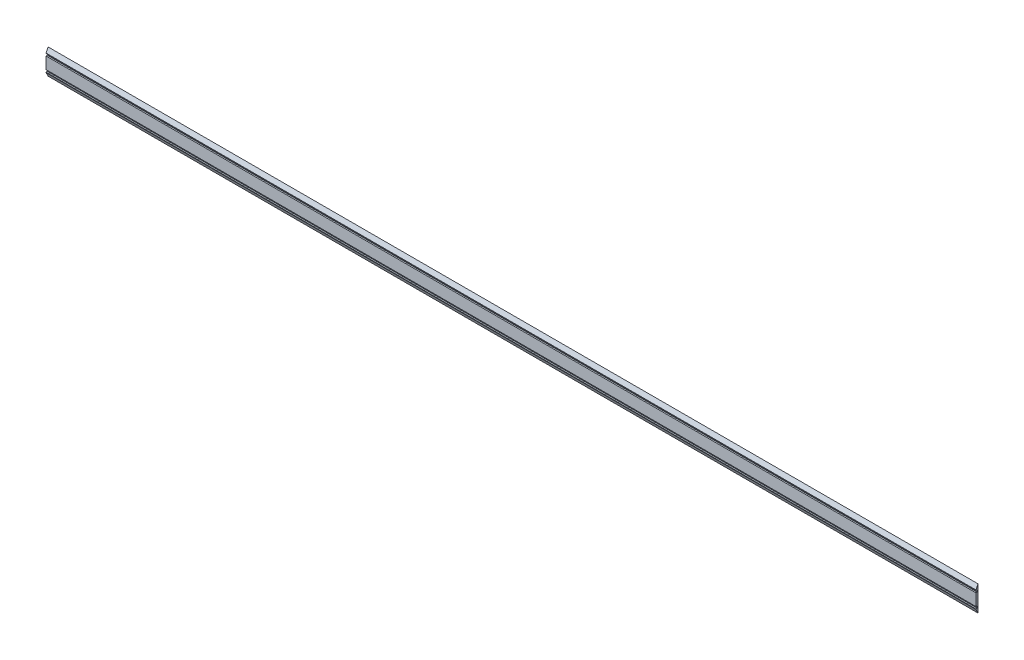
ISO-10303-21;
HEADER;
FILE_DESCRIPTION(('STEP AP214'),'2;1');
FILE_NAME('part.step','',(''),(''),'','','');
FILE_SCHEMA(('AUTOMOTIVE_DESIGN { 1 0 10303 214 1 1 1 1 }'));
ENDSEC;
DATA;
#1=APPLICATION_CONTEXT('core data for automotive mechanical design processes');
#2=APPLICATION_PROTOCOL_DEFINITION('international standard','automotive_design',2000,#1);
#3=PRODUCT_CONTEXT('',#1,'mechanical');
#4=PRODUCT('Part','Part','',(#3));
#5=PRODUCT_RELATED_PRODUCT_CATEGORY('part','',(#4));
#6=PRODUCT_DEFINITION_FORMATION('','',#4);
#7=PRODUCT_DEFINITION_CONTEXT('part definition',#1,'design');
#8=PRODUCT_DEFINITION('design','',#6,#7);
#9=PRODUCT_DEFINITION_SHAPE('','',#8);
#10=(LENGTH_UNIT() NAMED_UNIT(*) SI_UNIT(.MILLI.,.METRE.));
#11=(NAMED_UNIT(*) PLANE_ANGLE_UNIT() SI_UNIT($,.RADIAN.));
#12=(NAMED_UNIT(*) SI_UNIT($,.STERADIAN.) SOLID_ANGLE_UNIT());
#13=UNCERTAINTY_MEASURE_WITH_UNIT(LENGTH_MEASURE(1.E-05),#10,'distance_accuracy_value','');
#14=(GEOMETRIC_REPRESENTATION_CONTEXT(3) GLOBAL_UNCERTAINTY_ASSIGNED_CONTEXT((#13)) GLOBAL_UNIT_ASSIGNED_CONTEXT((#10,
#11,#12)) REPRESENTATION_CONTEXT('',''));
#15=CARTESIAN_POINT('',(0.,0.,0.));
#16=DIRECTION('',(0.,0.,1.));
#17=DIRECTION('',(1.,0.,0.));
#18=AXIS2_PLACEMENT_3D('',#15,#16,#17);
#19=CARTESIAN_POINT('',(0.,0.,5.));
#20=DIRECTION('',(0.,0.,-1.));
#21=DIRECTION('',(-1.,0.,0.));
#22=AXIS2_PLACEMENT_3D('',#19,#20,#21);
#23=PLANE('',#22);
#24=DIRECTION('',(0.,-1.,0.));
#25=VECTOR('',#24,1.);
#26=CARTESIAN_POINT('',(0.,-60.,5.));
#27=LINE('',#26,#25);
#28=CARTESIAN_POINT('',(0.,-16.0000000000002,5.));
#29=VERTEX_POINT('',#28);
#30=CARTESIAN_POINT('',(0.,-43.9999999999995,5.));
#31=VERTEX_POINT('',#30);
#32=EDGE_CURVE('E184',#29,#31,#27,.T.);
#33=ORIENTED_EDGE('',*,*,#32,.T.);
#34=DIRECTION('',(-1.,0.,0.));
#35=VECTOR('',#34,1.);
#36=CARTESIAN_POINT('',(0.,-43.9999999999995,5.));
#37=LINE('',#36,#35);
#38=CARTESIAN_POINT('',(2200.,-43.9999999999995,5.));
#39=VERTEX_POINT('',#38);
#40=EDGE_CURVE('E143',#39,#31,#37,.T.);
#41=ORIENTED_EDGE('',*,*,#40,.F.);
#42=DIRECTION('',(0.,1.,0.));
#43=VECTOR('',#42,1.);
#44=CARTESIAN_POINT('',(2200.,-60.,5.));
#45=LINE('',#44,#43);
#46=CARTESIAN_POINT('',(2200.,-16.,5.));
#47=VERTEX_POINT('',#46);
#48=EDGE_CURVE('E189',#39,#47,#45,.T.);
#49=ORIENTED_EDGE('',*,*,#48,.T.);
#50=DIRECTION('',(1.,0.,0.));
#51=VECTOR('',#50,1.);
#52=CARTESIAN_POINT('',(2200.,-16.,5.));
#53=LINE('',#52,#51);
#54=EDGE_CURVE('E159',#29,#47,#53,.T.);
#55=ORIENTED_EDGE('',*,*,#54,.F.);
#56=EDGE_LOOP('',(#33,#41,#49,#55));
#57=FACE_BOUND('',#56,.T.);
#58=ADVANCED_FACE('F38',(#57),#23,.F.);
#59=CARTESIAN_POINT('',(2200.,-49.9999999999995,5.));
#60=VERTEX_POINT('',#59);
#61=CARTESIAN_POINT('',(2200.,-48.9999999999995,5.));
#62=VERTEX_POINT('',#61);
#63=EDGE_CURVE('E185',#60,#62,#45,.T.);
#64=ORIENTED_EDGE('',*,*,#63,.T.);
#65=DIRECTION('',(1.,0.,0.));
#66=VECTOR('',#65,1.);
#67=CARTESIAN_POINT('',(0.,-48.9999999999995,5.));
#68=LINE('',#67,#66);
#69=CARTESIAN_POINT('',(0.,-48.9999999999995,5.));
#70=VERTEX_POINT('',#69);
#71=EDGE_CURVE('E173',#70,#62,#68,.T.);
#72=ORIENTED_EDGE('',*,*,#71,.F.);
#73=CARTESIAN_POINT('',(0.,-49.9999999999995,5.));
#74=VERTEX_POINT('',#73);
#75=EDGE_CURVE('E148',#70,#74,#27,.T.);
#76=ORIENTED_EDGE('',*,*,#75,.T.);
#77=DIRECTION('',(1.,0.,0.));
#78=VECTOR('',#77,1.);
#79=CARTESIAN_POINT('',(0.,-49.9999999999995,5.));
#80=LINE('',#79,#78);
#81=EDGE_CURVE('E188',#74,#60,#80,.T.);
#82=ORIENTED_EDGE('',*,*,#81,.T.);
#83=EDGE_LOOP('',(#64,#72,#76,#82));
#84=FACE_BOUND('',#83,.T.);
#85=ADVANCED_FACE('F245',(#84),#23,.F.);
#86=CARTESIAN_POINT('',(0.,-60.,5.));
#87=DIRECTION('',(1.,0.,0.));
#88=DIRECTION('',(0.,0.,-1.));
#89=AXIS2_PLACEMENT_3D('',#86,#87,#88);
#90=PLANE('',#89);
#91=DIRECTION('',(0.,-1.,0.));
#92=VECTOR('',#91,1.);
#93=CARTESIAN_POINT('',(0.,-48.9999999999995,2.));
#94=LINE('',#93,#92);
#95=CARTESIAN_POINT('',(0.,-43.9999999999995,2.));
#96=VERTEX_POINT('',#95);
#97=CARTESIAN_POINT('',(0.,-48.9999999999995,2.));
#98=VERTEX_POINT('',#97);
#99=EDGE_CURVE('E134',#96,#98,#94,.T.);
#100=ORIENTED_EDGE('',*,*,#99,.F.);
#101=DIRECTION('',(0.,0.,1.));
#102=VECTOR('',#101,1.);
#103=CARTESIAN_POINT('',(0.,-43.9999999999995,2.));
#104=LINE('',#103,#102);
#105=EDGE_CURVE('E194',#96,#31,#104,.T.);
#106=ORIENTED_EDGE('',*,*,#105,.T.);
#107=ORIENTED_EDGE('',*,*,#32,.F.);
#108=DIRECTION('',(0.,0.,1.));
#109=VECTOR('',#108,1.);
#110=CARTESIAN_POINT('',(0.,-16.0000000000002,2.));
#111=LINE('',#110,#109);
#112=CARTESIAN_POINT('',(0.,-16.0000000000002,2.));
#113=VERTEX_POINT('',#112);
#114=EDGE_CURVE('E174',#113,#29,#111,.T.);
#115=ORIENTED_EDGE('',*,*,#114,.F.);
#116=DIRECTION('',(0.,-1.,0.));
#117=VECTOR('',#116,1.);
#118=CARTESIAN_POINT('',(0.,-11.0000000000002,2.));
#119=LINE('',#118,#117);
#120=CARTESIAN_POINT('',(0.,-11.0000000000002,2.));
#121=VERTEX_POINT('',#120);
#122=EDGE_CURVE('E162',#121,#113,#119,.T.);
#123=ORIENTED_EDGE('',*,*,#122,.F.);
#124=DIRECTION('',(0.,0.,1.));
#125=VECTOR('',#124,1.);
#126=CARTESIAN_POINT('',(0.,-11.0000000000002,2.));
#127=LINE('',#126,#125);
#128=CARTESIAN_POINT('',(0.,-11.0000000000002,5.));
#129=VERTEX_POINT('',#128);
#130=EDGE_CURVE('E176',#121,#129,#127,.T.);
#131=ORIENTED_EDGE('',*,*,#130,.T.);
#132=CARTESIAN_POINT('',(0.,-10.0000000000002,5.));
#133=VERTEX_POINT('',#132);
#134=EDGE_CURVE('E180',#133,#129,#27,.T.);
#135=ORIENTED_EDGE('',*,*,#134,.F.);
#136=DIRECTION('',(0.,-0.89442719099992,0.44721359549995));
#137=VECTOR('',#136,1.);
#138=CARTESIAN_POINT('',(0.,-10.0000000000002,5.));
#139=LINE('',#138,#137);
#140=CARTESIAN_POINT('',(0.,0.,0.));
#141=VERTEX_POINT('',#140);
#142=EDGE_CURVE('E209',#133,#141,#139,.F.);
#143=ORIENTED_EDGE('',*,*,#142,.T.);
#144=DIRECTION('',(0.,-1.,0.));
#145=VECTOR('',#144,1.);
#146=CARTESIAN_POINT('',(0.,-60.,0.));
#147=LINE('',#146,#145);
#148=CARTESIAN_POINT('',(0.,-60.,0.));
#149=VERTEX_POINT('',#148);
#150=EDGE_CURVE('E190',#141,#149,#147,.T.);
#151=ORIENTED_EDGE('',*,*,#150,.T.);
#152=DIRECTION('',(0.,-0.894427190999916,-0.447213595499958));
#153=VECTOR('',#152,1.);
#154=CARTESIAN_POINT('',(0.,-49.9999999999995,5.));
#155=LINE('',#154,#153);
#156=EDGE_CURVE('E207',#149,#74,#155,.F.);
#157=ORIENTED_EDGE('',*,*,#156,.T.);
#158=ORIENTED_EDGE('',*,*,#75,.F.);
#159=DIRECTION('',(0.,0.,1.));
#160=VECTOR('',#159,1.);
#161=CARTESIAN_POINT('',(0.,-48.9999999999995,2.));
#162=LINE('',#161,#160);
#163=EDGE_CURVE('E54',#98,#70,#162,.T.);
#164=ORIENTED_EDGE('',*,*,#163,.F.);
#165=EDGE_LOOP('',(#100,#106,#107,#115,#123,#131,#135,#143,#151,#157,#158,#164));
#166=FACE_BOUND('',#165,.T.);
#167=ADVANCED_FACE('F146',(#166),#90,.F.);
#168=CARTESIAN_POINT('',(2200.,-60.,5.));
#169=DIRECTION('',(-1.,0.,0.));
#170=DIRECTION('',(0.,0.,1.));
#171=AXIS2_PLACEMENT_3D('',#168,#169,#170);
#172=PLANE('',#171);
#173=ORIENTED_EDGE('',*,*,#48,.F.);
#174=DIRECTION('',(0.,0.,1.));
#175=VECTOR('',#174,1.);
#176=CARTESIAN_POINT('',(2200.,-43.9999999999995,2.));
#177=LINE('',#176,#175);
#178=CARTESIAN_POINT('',(2200.,-43.9999999999995,2.));
#179=VERTEX_POINT('',#178);
#180=EDGE_CURVE('E150',#179,#39,#177,.T.);
#181=ORIENTED_EDGE('',*,*,#180,.F.);
#182=DIRECTION('',(0.,1.,0.));
#183=VECTOR('',#182,1.);
#184=CARTESIAN_POINT('',(2200.,-48.9999999999995,2.));
#185=LINE('',#184,#183);
#186=CARTESIAN_POINT('',(2200.,-48.9999999999995,2.));
#187=VERTEX_POINT('',#186);
#188=EDGE_CURVE('E133',#187,#179,#185,.T.);
#189=ORIENTED_EDGE('',*,*,#188,.F.);
#190=DIRECTION('',(0.,0.,1.));
#191=VECTOR('',#190,1.);
#192=CARTESIAN_POINT('',(2200.,-48.9999999999995,2.));
#193=LINE('',#192,#191);
#194=EDGE_CURVE('E130',#187,#62,#193,.T.);
#195=ORIENTED_EDGE('',*,*,#194,.T.);
#196=ORIENTED_EDGE('',*,*,#63,.F.);
#197=DIRECTION('',(0.,0.894427190999916,0.447213595499958));
#198=VECTOR('',#197,1.);
#199=CARTESIAN_POINT('',(2200.,-49.9999999999995,5.));
#200=LINE('',#199,#198);
#201=CARTESIAN_POINT('',(2200.,-60.,0.));
#202=VERTEX_POINT('',#201);
#203=EDGE_CURVE('E47',#60,#202,#200,.F.);
#204=ORIENTED_EDGE('',*,*,#203,.T.);
#205=DIRECTION('',(0.,1.,0.));
#206=VECTOR('',#205,1.);
#207=CARTESIAN_POINT('',(2200.,-60.,0.));
#208=LINE('',#207,#206);
#209=CARTESIAN_POINT('',(2200.,0.,0.));
#210=VERTEX_POINT('',#209);
#211=EDGE_CURVE('E197',#202,#210,#208,.T.);
#212=ORIENTED_EDGE('',*,*,#211,.T.);
#213=DIRECTION('',(0.,0.89442719099992,-0.44721359549995));
#214=VECTOR('',#213,1.);
#215=CARTESIAN_POINT('',(2200.,-10.0000000000002,5.));
#216=LINE('',#215,#214);
#217=CARTESIAN_POINT('',(2200.,-10.0000000000002,5.));
#218=VERTEX_POINT('',#217);
#219=EDGE_CURVE('E11',#210,#218,#216,.F.);
#220=ORIENTED_EDGE('',*,*,#219,.T.);
#221=CARTESIAN_POINT('',(2200.,-11.0000000000001,5.));
#222=VERTEX_POINT('',#221);
#223=EDGE_CURVE('E183',#222,#218,#45,.T.);
#224=ORIENTED_EDGE('',*,*,#223,.F.);
#225=DIRECTION('',(0.,0.,1.));
#226=VECTOR('',#225,1.);
#227=CARTESIAN_POINT('',(2200.,-11.,2.));
#228=LINE('',#227,#226);
#229=CARTESIAN_POINT('',(2200.,-11.,2.));
#230=VERTEX_POINT('',#229);
#231=EDGE_CURVE('E62',#230,#222,#228,.T.);
#232=ORIENTED_EDGE('',*,*,#231,.F.);
#233=DIRECTION('',(0.,1.,0.));
#234=VECTOR('',#233,1.);
#235=CARTESIAN_POINT('',(2200.,-11.,2.));
#236=LINE('',#235,#234);
#237=CARTESIAN_POINT('',(2200.,-16.,2.));
#238=VERTEX_POINT('',#237);
#239=EDGE_CURVE('E155',#238,#230,#236,.T.);
#240=ORIENTED_EDGE('',*,*,#239,.F.);
#241=DIRECTION('',(0.,0.,1.));
#242=VECTOR('',#241,1.);
#243=CARTESIAN_POINT('',(2200.,-16.,2.));
#244=LINE('',#243,#242);
#245=EDGE_CURVE('E170',#238,#47,#244,.T.);
#246=ORIENTED_EDGE('',*,*,#245,.T.);
#247=EDGE_LOOP('',(#173,#181,#189,#195,#196,#204,#212,#220,#224,#232,#240,#246));
#248=FACE_BOUND('',#247,.T.);
#249=ADVANCED_FACE('F214',(#248),#172,.F.);
#250=ORIENTED_EDGE('',*,*,#134,.T.);
#251=DIRECTION('',(-1.,0.,0.));
#252=VECTOR('',#251,1.);
#253=CARTESIAN_POINT('',(2200.,-11.,5.));
#254=LINE('',#253,#252);
#255=EDGE_CURVE('E167',#222,#129,#254,.T.);
#256=ORIENTED_EDGE('',*,*,#255,.F.);
#257=ORIENTED_EDGE('',*,*,#223,.T.);
#258=DIRECTION('',(-1.,0.,0.));
#259=VECTOR('',#258,1.);
#260=CARTESIAN_POINT('',(0.,-10.0000000000002,5.));
#261=LINE('',#260,#259);
#262=EDGE_CURVE('E204',#218,#133,#261,.T.);
#263=ORIENTED_EDGE('',*,*,#262,.T.);
#264=EDGE_LOOP('',(#250,#256,#257,#263));
#265=FACE_BOUND('',#264,.T.);
#266=ADVANCED_FACE('F264',(#265),#23,.F.);
#267=CARTESIAN_POINT('',(0.,0.,0.));
#268=DIRECTION('',(0.,0.,-1.));
#269=DIRECTION('',(-1.,0.,0.));
#270=AXIS2_PLACEMENT_3D('',#267,#268,#269);
#271=PLANE('',#270);
#272=ORIENTED_EDGE('',*,*,#150,.F.);
#273=DIRECTION('',(-1.,0.,0.));
#274=VECTOR('',#273,1.);
#275=CARTESIAN_POINT('',(0.,0.,0.));
#276=LINE('',#275,#274);
#277=EDGE_CURVE('E199',#210,#141,#276,.T.);
#278=ORIENTED_EDGE('',*,*,#277,.F.);
#279=ORIENTED_EDGE('',*,*,#211,.F.);
#280=DIRECTION('',(1.,0.,0.));
#281=VECTOR('',#280,1.);
#282=CARTESIAN_POINT('',(0.,-60.,0.));
#283=LINE('',#282,#281);
#284=EDGE_CURVE('E193',#149,#202,#283,.T.);
#285=ORIENTED_EDGE('',*,*,#284,.F.);
#286=EDGE_LOOP('',(#272,#278,#279,#285));
#287=FACE_BOUND('',#286,.T.);
#288=ADVANCED_FACE('F220',(#287),#271,.T.);
#289=CARTESIAN_POINT('',(0.,-10.0000000000002,5.));
#290=DIRECTION('',(0.,-0.44721359549995,-0.89442719099992));
#291=DIRECTION('',(-1.,0.,0.));
#292=AXIS2_PLACEMENT_3D('',#289,#290,#291);
#293=PLANE('',#292);
#294=ORIENTED_EDGE('',*,*,#219,.F.);
#295=ORIENTED_EDGE('',*,*,#277,.T.);
#296=ORIENTED_EDGE('',*,*,#142,.F.);
#297=ORIENTED_EDGE('',*,*,#262,.F.);
#298=EDGE_LOOP('',(#294,#295,#296,#297));
#299=FACE_BOUND('',#298,.T.);
#300=ADVANCED_FACE('F225',(#299),#293,.F.);
#301=CARTESIAN_POINT('',(0.,-49.9999999999995,5.));
#302=DIRECTION('',(0.,0.447213595499958,-0.894427190999916));
#303=DIRECTION('',(1.,0.,0.));
#304=AXIS2_PLACEMENT_3D('',#301,#302,#303);
#305=PLANE('',#304);
#306=ORIENTED_EDGE('',*,*,#156,.F.);
#307=ORIENTED_EDGE('',*,*,#284,.T.);
#308=ORIENTED_EDGE('',*,*,#203,.F.);
#309=ORIENTED_EDGE('',*,*,#81,.F.);
#310=EDGE_LOOP('',(#306,#307,#308,#309));
#311=FACE_BOUND('',#310,.T.);
#312=ADVANCED_FACE('F41',(#311),#305,.F.);
#313=CARTESIAN_POINT('',(2200.,-16.,2.));
#314=DIRECTION('',(0.,-1.,0.));
#315=DIRECTION('',(1.,0.,0.));
#316=AXIS2_PLACEMENT_3D('',#313,#314,#315);
#317=PLANE('',#316);
#318=ORIENTED_EDGE('',*,*,#54,.T.);
#319=ORIENTED_EDGE('',*,*,#245,.F.);
#320=DIRECTION('',(1.,0.,0.));
#321=VECTOR('',#320,1.);
#322=CARTESIAN_POINT('',(2200.,-16.,2.));
#323=LINE('',#322,#321);
#324=EDGE_CURVE('E164',#113,#238,#323,.T.);
#325=ORIENTED_EDGE('',*,*,#324,.F.);
#326=ORIENTED_EDGE('',*,*,#114,.T.);
#327=EDGE_LOOP('',(#318,#319,#325,#326));
#328=FACE_BOUND('',#327,.T.);
#329=ADVANCED_FACE('F239',(#328),#317,.F.);
#330=CARTESIAN_POINT('',(2200.,-11.,2.));
#331=DIRECTION('',(0.,1.,0.));
#332=DIRECTION('',(-1.,0.,0.));
#333=AXIS2_PLACEMENT_3D('',#330,#331,#332);
#334=PLANE('',#333);
#335=ORIENTED_EDGE('',*,*,#255,.T.);
#336=ORIENTED_EDGE('',*,*,#130,.F.);
#337=DIRECTION('',(-1.,0.,0.));
#338=VECTOR('',#337,1.);
#339=CARTESIAN_POINT('',(2200.,-11.,2.));
#340=LINE('',#339,#338);
#341=EDGE_CURVE('E158',#230,#121,#340,.T.);
#342=ORIENTED_EDGE('',*,*,#341,.F.);
#343=ORIENTED_EDGE('',*,*,#231,.T.);
#344=EDGE_LOOP('',(#335,#336,#342,#343));
#345=FACE_BOUND('',#344,.T.);
#346=ADVANCED_FACE('F259',(#345),#334,.F.);
#347=CARTESIAN_POINT('',(0.,0.,2.));
#348=DIRECTION('',(0.,0.,-1.));
#349=DIRECTION('',(-1.,0.,0.));
#350=AXIS2_PLACEMENT_3D('',#347,#348,#349);
#351=PLANE('',#350);
#352=ORIENTED_EDGE('',*,*,#239,.T.);
#353=ORIENTED_EDGE('',*,*,#341,.T.);
#354=ORIENTED_EDGE('',*,*,#122,.T.);
#355=ORIENTED_EDGE('',*,*,#324,.T.);
#356=EDGE_LOOP('',(#352,#353,#354,#355));
#357=FACE_BOUND('',#356,.T.);
#358=ADVANCED_FACE('F242',(#357),#351,.F.);
#359=CARTESIAN_POINT('',(0.,-43.9999999999995,2.));
#360=DIRECTION('',(0.,1.,0.));
#361=DIRECTION('',(0.,0.,1.));
#362=AXIS2_PLACEMENT_3D('',#359,#360,#361);
#363=PLANE('',#362);
#364=ORIENTED_EDGE('',*,*,#40,.T.);
#365=ORIENTED_EDGE('',*,*,#105,.F.);
#366=DIRECTION('',(-1.,0.,0.));
#367=VECTOR('',#366,1.);
#368=CARTESIAN_POINT('',(0.,-43.9999999999995,2.));
#369=LINE('',#368,#367);
#370=EDGE_CURVE('E140',#179,#96,#369,.T.);
#371=ORIENTED_EDGE('',*,*,#370,.F.);
#372=ORIENTED_EDGE('',*,*,#180,.T.);
#373=EDGE_LOOP('',(#364,#365,#371,#372));
#374=FACE_BOUND('',#373,.T.);
#375=ADVANCED_FACE('F251',(#374),#363,.F.);
#376=CARTESIAN_POINT('',(0.,-48.9999999999995,2.));
#377=DIRECTION('',(0.,-1.,0.));
#378=DIRECTION('',(0.,0.,-1.));
#379=AXIS2_PLACEMENT_3D('',#376,#377,#378);
#380=PLANE('',#379);
#381=ORIENTED_EDGE('',*,*,#71,.T.);
#382=ORIENTED_EDGE('',*,*,#194,.F.);
#383=DIRECTION('',(1.,0.,0.));
#384=VECTOR('',#383,1.);
#385=CARTESIAN_POINT('',(0.,-48.9999999999995,2.));
#386=LINE('',#385,#384);
#387=EDGE_CURVE('E126',#98,#187,#386,.T.);
#388=ORIENTED_EDGE('',*,*,#387,.F.);
#389=ORIENTED_EDGE('',*,*,#163,.T.);
#390=EDGE_LOOP('',(#381,#382,#388,#389));
#391=FACE_BOUND('',#390,.T.);
#392=ADVANCED_FACE('F128',(#391),#380,.F.);
#393=CARTESIAN_POINT('',(0.,0.,2.));
#394=DIRECTION('',(0.,0.,-1.));
#395=DIRECTION('',(-1.,0.,0.));
#396=AXIS2_PLACEMENT_3D('',#393,#394,#395);
#397=PLANE('',#396);
#398=ORIENTED_EDGE('',*,*,#99,.T.);
#399=ORIENTED_EDGE('',*,*,#387,.T.);
#400=ORIENTED_EDGE('',*,*,#188,.T.);
#401=ORIENTED_EDGE('',*,*,#370,.T.);
#402=EDGE_LOOP('',(#398,#399,#400,#401));
#403=FACE_BOUND('',#402,.T.);
#404=ADVANCED_FACE('F138',(#403),#397,.F.);
#405=CLOSED_SHELL('',(#58,#85,#167,#249,#266,#288,#300,#312,#329,#346,#358,#375,#392,#404));
#406=MANIFOLD_SOLID_BREP('B2',#405);
#407=ADVANCED_BREP_SHAPE_REPRESENTATION('',(#18,#406),#14);
#408=SHAPE_DEFINITION_REPRESENTATION(#9,#407);
ENDSEC;
END-ISO-10303-21;
